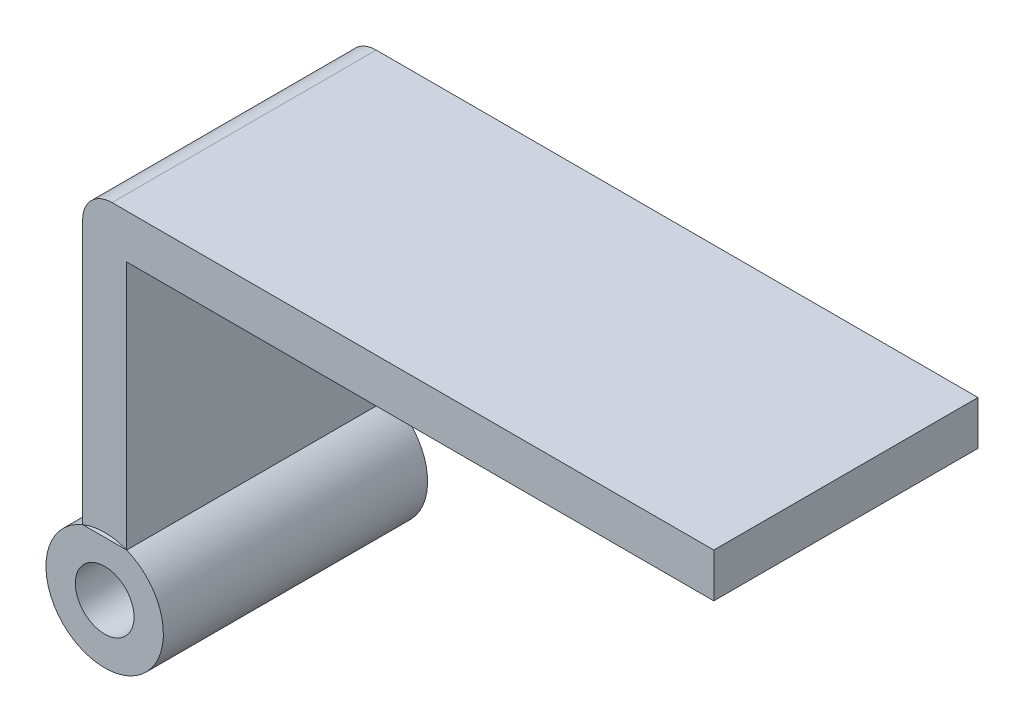
ISO-10303-21;
HEADER;
FILE_DESCRIPTION(('STEP AP214'),'2;1');
FILE_NAME('part.step','',(''),(''),'','','');
FILE_SCHEMA(('AUTOMOTIVE_DESIGN { 1 0 10303 214 1 1 1 1 }'));
ENDSEC;
DATA;
#1=APPLICATION_CONTEXT('core data for automotive mechanical design processes');
#2=APPLICATION_PROTOCOL_DEFINITION('international standard','automotive_design',2000,#1);
#3=PRODUCT_CONTEXT('',#1,'mechanical');
#4=PRODUCT('Part','Part','',(#3));
#5=PRODUCT_RELATED_PRODUCT_CATEGORY('part','',(#4));
#6=PRODUCT_DEFINITION_FORMATION('','',#4);
#7=PRODUCT_DEFINITION_CONTEXT('part definition',#1,'design');
#8=PRODUCT_DEFINITION('design','',#6,#7);
#9=PRODUCT_DEFINITION_SHAPE('','',#8);
#10=(LENGTH_UNIT() NAMED_UNIT(*) SI_UNIT(.MILLI.,.METRE.));
#11=(NAMED_UNIT(*) PLANE_ANGLE_UNIT() SI_UNIT($,.RADIAN.));
#12=(NAMED_UNIT(*) SI_UNIT($,.STERADIAN.) SOLID_ANGLE_UNIT());
#13=UNCERTAINTY_MEASURE_WITH_UNIT(LENGTH_MEASURE(1.E-05),#10,'distance_accuracy_value','');
#14=(GEOMETRIC_REPRESENTATION_CONTEXT(3) GLOBAL_UNCERTAINTY_ASSIGNED_CONTEXT((#13)) GLOBAL_UNIT_ASSIGNED_CONTEXT((#10,
#11,#12)) REPRESENTATION_CONTEXT('',''));
#15=CARTESIAN_POINT('',(0.,0.,0.));
#16=DIRECTION('',(0.,0.,1.));
#17=DIRECTION('',(1.,0.,0.));
#18=AXIS2_PLACEMENT_3D('',#15,#16,#17);
#19=CARTESIAN_POINT('',(0.,30.3964397372014,18.));
#20=DIRECTION('',(0.,1.,0.));
#21=DIRECTION('',(0.,0.,1.));
#22=AXIS2_PLACEMENT_3D('',#19,#20,#21);
#23=PLANE('',#22);
#24=DIRECTION('',(1.,0.,0.));
#25=VECTOR('',#24,1.);
#26=CARTESIAN_POINT('',(0.,30.3964397372014,0.));
#27=LINE('',#26,#25);
#28=CARTESIAN_POINT('',(-1.5,30.3964397372014,0.));
#29=VERTEX_POINT('',#28);
#30=CARTESIAN_POINT('',(1.5,30.3964397372014,0.));
#31=VERTEX_POINT('',#30);
#32=EDGE_CURVE('E100',#29,#31,#27,.T.);
#33=ORIENTED_EDGE('',*,*,#32,.F.);
#34=DIRECTION('',(0.,0.,-1.));
#35=VECTOR('',#34,1.);
#36=CARTESIAN_POINT('',(-1.5,30.3964397372014,18.));
#37=LINE('',#36,#35);
#38=CARTESIAN_POINT('',(-1.5,30.3964397372014,18.));
#39=VERTEX_POINT('',#38);
#40=EDGE_CURVE('E13',#39,#29,#37,.T.);
#41=ORIENTED_EDGE('',*,*,#40,.F.);
#42=DIRECTION('',(1.,0.,0.));
#43=VECTOR('',#42,1.);
#44=CARTESIAN_POINT('',(0.,30.3964397372014,18.));
#45=LINE('',#44,#43);
#46=CARTESIAN_POINT('',(1.5,30.3964397372014,18.));
#47=VERTEX_POINT('',#46);
#48=EDGE_CURVE('E101',#39,#47,#45,.T.);
#49=ORIENTED_EDGE('',*,*,#48,.T.);
#50=DIRECTION('',(0.,0.,-1.));
#51=VECTOR('',#50,1.);
#52=CARTESIAN_POINT('',(1.5,30.3964397372014,18.));
#53=LINE('',#52,#51);
#54=EDGE_CURVE('E80',#47,#31,#53,.T.);
#55=ORIENTED_EDGE('',*,*,#54,.T.);
#56=EDGE_LOOP('',(#33,#41,#49,#55));
#57=FACE_BOUND('',#56,.T.);
#58=ADVANCED_FACE('F71',(#57),#23,.T.);
#59=CARTESIAN_POINT('',(0.,26.6883404936536,18.));
#60=DIRECTION('',(0.,0.,-1.));
#61=DIRECTION('',(-1.,0.,0.));
#62=AXIS2_PLACEMENT_3D('',#59,#60,#61);
#63=CYLINDRICAL_SURFACE('',#62,2.);
#64=CARTESIAN_POINT('',(0.,26.6883404936536,18.));
#65=DIRECTION('',(0.,0.,1.));
#66=DIRECTION('',(1.,0.,0.));
#67=AXIS2_PLACEMENT_3D('',#64,#65,#66);
#68=CIRCLE('',#67,2.);
#69=CARTESIAN_POINT('',(2.,26.6883404936536,18.));
#70=VERTEX_POINT('',#69);
#71=EDGE_CURVE('E105',#70,#70,#68,.T.);
#72=ORIENTED_EDGE('',*,*,#71,.T.);
#73=EDGE_LOOP('',(#72));
#74=FACE_BOUND('',#73,.T.);
#75=CARTESIAN_POINT('',(0.,26.6883404936536,0.));
#76=DIRECTION('',(0.,0.,1.));
#77=DIRECTION('',(1.,0.,0.));
#78=AXIS2_PLACEMENT_3D('',#75,#76,#77);
#79=CIRCLE('',#78,2.);
#80=CARTESIAN_POINT('',(2.,26.6883404936536,0.));
#81=VERTEX_POINT('',#80);
#82=EDGE_CURVE('E108',#81,#81,#79,.T.);
#83=ORIENTED_EDGE('',*,*,#82,.F.);
#84=EDGE_LOOP('',(#83));
#85=FACE_BOUND('',#84,.T.);
#86=ADVANCED_FACE('F73',(#74,#85),#63,.F.);
#87=CARTESIAN_POINT('',(0.,26.6883404936536,18.));
#88=DIRECTION('',(0.,0.,-1.));
#89=DIRECTION('',(-1.,0.,0.));
#90=AXIS2_PLACEMENT_3D('',#87,#88,#89);
#91=CYLINDRICAL_SURFACE('',#90,4.);
#92=CARTESIAN_POINT('',(0.,26.6883404936536,0.));
#93=DIRECTION('',(0.,0.,1.));
#94=DIRECTION('',(1.,0.,0.));
#95=AXIS2_PLACEMENT_3D('',#92,#93,#94);
#96=CIRCLE('',#95,4.);
#97=EDGE_CURVE('E102',#29,#31,#96,.T.);
#98=ORIENTED_EDGE('',*,*,#97,.T.);
#99=ORIENTED_EDGE('',*,*,#54,.F.);
#100=CARTESIAN_POINT('',(0.,26.6883404936536,18.));
#101=DIRECTION('',(0.,0.,1.));
#102=DIRECTION('',(1.,0.,0.));
#103=AXIS2_PLACEMENT_3D('',#100,#101,#102);
#104=CIRCLE('',#103,4.);
#105=EDGE_CURVE('E87',#39,#47,#104,.T.);
#106=ORIENTED_EDGE('',*,*,#105,.F.);
#107=ORIENTED_EDGE('',*,*,#40,.T.);
#108=EDGE_LOOP('',(#98,#99,#106,#107));
#109=FACE_BOUND('',#108,.T.);
#110=ADVANCED_FACE('F103',(#109),#91,.T.);
#111=CARTESIAN_POINT('',(0.,0.,18.));
#112=DIRECTION('',(0.,0.,1.));
#113=DIRECTION('',(1.,0.,0.));
#114=AXIS2_PLACEMENT_3D('',#111,#112,#113);
#115=PLANE('',#114);
#116=ORIENTED_EDGE('',*,*,#71,.F.);
#117=EDGE_LOOP('',(#116));
#118=FACE_BOUND('',#117,.T.);
#119=ORIENTED_EDGE('',*,*,#48,.F.);
#120=ORIENTED_EDGE('',*,*,#105,.T.);
#121=EDGE_LOOP('',(#119,#120));
#122=FACE_BOUND('',#121,.T.);
#123=ADVANCED_FACE('F120',(#118,#122),#115,.T.);
#124=CARTESIAN_POINT('',(0.,0.,0.));
#125=DIRECTION('',(0.,0.,1.));
#126=DIRECTION('',(1.,0.,0.));
#127=AXIS2_PLACEMENT_3D('',#124,#125,#126);
#128=PLANE('',#127);
#129=ORIENTED_EDGE('',*,*,#82,.T.);
#130=EDGE_LOOP('',(#129));
#131=FACE_BOUND('',#130,.T.);
#132=ORIENTED_EDGE('',*,*,#32,.T.);
#133=ORIENTED_EDGE('',*,*,#97,.F.);
#134=EDGE_LOOP('',(#132,#133));
#135=FACE_BOUND('',#134,.T.);
#136=ADVANCED_FACE('F107',(#131,#135),#128,.F.);
#137=CLOSED_SHELL('',(#58,#86,#110,#123,#136));
#138=MANIFOLD_SOLID_BREP('B2',#137);
#139=CARTESIAN_POINT('',(0.,26.6883404936536,18.));
#140=DIRECTION('',(0.,0.,-1.));
#141=DIRECTION('',(-1.,0.,0.));
#142=AXIS2_PLACEMENT_3D('',#139,#140,#141);
#143=CYLINDRICAL_SURFACE('',#142,4.);
#144=CARTESIAN_POINT('',(0.,26.6883404936536,0.));
#145=DIRECTION('',(0.,0.,1.));
#146=DIRECTION('',(1.,0.,0.));
#147=AXIS2_PLACEMENT_3D('',#144,#145,#146);
#148=CIRCLE('',#147,4.);
#149=CARTESIAN_POINT('',(1.5,30.3964397372014,0.));
#150=VERTEX_POINT('',#149);
#151=CARTESIAN_POINT('',(-1.5,30.3964397372014,0.));
#152=VERTEX_POINT('',#151);
#153=EDGE_CURVE('E227',#150,#152,#148,.T.);
#154=ORIENTED_EDGE('',*,*,#153,.F.);
#155=DIRECTION('',(0.,0.,-1.));
#156=VECTOR('',#155,1.);
#157=CARTESIAN_POINT('',(1.5,30.3964397372014,18.));
#158=LINE('',#157,#156);
#159=CARTESIAN_POINT('',(1.5,30.3964397372014,18.));
#160=VERTEX_POINT('',#159);
#161=EDGE_CURVE('E221',#160,#150,#158,.T.);
#162=ORIENTED_EDGE('',*,*,#161,.F.);
#163=CARTESIAN_POINT('',(0.,26.6883404936536,18.));
#164=DIRECTION('',(0.,0.,1.));
#165=DIRECTION('',(1.,0.,0.));
#166=AXIS2_PLACEMENT_3D('',#163,#164,#165);
#167=CIRCLE('',#166,4.);
#168=CARTESIAN_POINT('',(-1.5,30.3964397372014,18.));
#169=VERTEX_POINT('',#168);
#170=EDGE_CURVE('E224',#160,#169,#167,.T.);
#171=ORIENTED_EDGE('',*,*,#170,.T.);
#172=DIRECTION('',(0.,0.,-1.));
#173=VECTOR('',#172,1.);
#174=CARTESIAN_POINT('',(-1.5,30.3964397372014,18.));
#175=LINE('',#174,#173);
#176=EDGE_CURVE('E256',#169,#152,#175,.T.);
#177=ORIENTED_EDGE('',*,*,#176,.T.);
#178=EDGE_LOOP('',(#154,#162,#171,#177));
#179=FACE_BOUND('',#178,.T.);
#180=ADVANCED_FACE('F164',(#179),#143,.F.);
#181=CARTESIAN_POINT('',(1.5,0.,18.));
#182=DIRECTION('',(-1.,0.,0.));
#183=DIRECTION('',(0.,0.,1.));
#184=AXIS2_PLACEMENT_3D('',#181,#182,#183);
#185=PLANE('',#184);
#186=DIRECTION('',(0.,1.,0.));
#187=VECTOR('',#186,1.);
#188=CARTESIAN_POINT('',(1.5,0.,0.));
#189=LINE('',#188,#187);
#190=CARTESIAN_POINT('',(1.5,47.3964397372014,0.));
#191=VERTEX_POINT('',#190);
#192=EDGE_CURVE('E258',#150,#191,#189,.T.);
#193=ORIENTED_EDGE('',*,*,#192,.T.);
#194=DIRECTION('',(0.,0.,-1.));
#195=VECTOR('',#194,1.);
#196=CARTESIAN_POINT('',(1.5,47.3964397372014,18.));
#197=LINE('',#196,#195);
#198=CARTESIAN_POINT('',(1.5,47.3964397372014,18.));
#199=VERTEX_POINT('',#198);
#200=EDGE_CURVE('E231',#199,#191,#197,.T.);
#201=ORIENTED_EDGE('',*,*,#200,.F.);
#202=DIRECTION('',(0.,1.,0.));
#203=VECTOR('',#202,1.);
#204=CARTESIAN_POINT('',(1.5,0.,18.));
#205=LINE('',#204,#203);
#206=EDGE_CURVE('E234',#160,#199,#205,.T.);
#207=ORIENTED_EDGE('',*,*,#206,.F.);
#208=ORIENTED_EDGE('',*,*,#161,.T.);
#209=EDGE_LOOP('',(#193,#201,#207,#208));
#210=FACE_BOUND('',#209,.T.);
#211=ADVANCED_FACE('F235',(#210),#185,.F.);
#212=CARTESIAN_POINT('',(0.,47.3964397372014,18.));
#213=DIRECTION('',(0.,1.,0.));
#214=DIRECTION('',(0.,0.,1.));
#215=AXIS2_PLACEMENT_3D('',#212,#213,#214);
#216=PLANE('',#215);
#217=DIRECTION('',(1.,0.,0.));
#218=VECTOR('',#217,1.);
#219=CARTESIAN_POINT('',(0.,47.3964397372014,0.));
#220=LINE('',#219,#218);
#221=CARTESIAN_POINT('',(41.5,47.3964397372014,0.));
#222=VERTEX_POINT('',#221);
#223=EDGE_CURVE('E260',#191,#222,#220,.T.);
#224=ORIENTED_EDGE('',*,*,#223,.T.);
#225=DIRECTION('',(0.,0.,-1.));
#226=VECTOR('',#225,1.);
#227=CARTESIAN_POINT('',(41.5,47.3964397372014,18.));
#228=LINE('',#227,#226);
#229=CARTESIAN_POINT('',(41.5,47.3964397372014,18.));
#230=VERTEX_POINT('',#229);
#231=EDGE_CURVE('E271',#230,#222,#228,.T.);
#232=ORIENTED_EDGE('',*,*,#231,.F.);
#233=DIRECTION('',(1.,0.,0.));
#234=VECTOR('',#233,1.);
#235=CARTESIAN_POINT('',(0.,47.3964397372014,18.));
#236=LINE('',#235,#234);
#237=EDGE_CURVE('E239',#199,#230,#236,.T.);
#238=ORIENTED_EDGE('',*,*,#237,.F.);
#239=ORIENTED_EDGE('',*,*,#200,.T.);
#240=EDGE_LOOP('',(#224,#232,#238,#239));
#241=FACE_BOUND('',#240,.T.);
#242=ADVANCED_FACE('F285',(#241),#216,.F.);
#243=CARTESIAN_POINT('',(41.5,0.,18.));
#244=DIRECTION('',(1.,0.,0.));
#245=DIRECTION('',(0.,0.,-1.));
#246=AXIS2_PLACEMENT_3D('',#243,#244,#245);
#247=PLANE('',#246);
#248=DIRECTION('',(0.,-1.,0.));
#249=VECTOR('',#248,1.);
#250=CARTESIAN_POINT('',(41.5,0.,0.));
#251=LINE('',#250,#249);
#252=CARTESIAN_POINT('',(41.5,50.3964397372014,0.));
#253=VERTEX_POINT('',#252);
#254=EDGE_CURVE('E263',#253,#222,#251,.T.);
#255=ORIENTED_EDGE('',*,*,#254,.F.);
#256=DIRECTION('',(0.,0.,-1.));
#257=VECTOR('',#256,1.);
#258=CARTESIAN_POINT('',(41.5,50.3964397372014,18.));
#259=LINE('',#258,#257);
#260=CARTESIAN_POINT('',(41.5,50.3964397372014,18.));
#261=VERTEX_POINT('',#260);
#262=EDGE_CURVE('E268',#261,#253,#259,.T.);
#263=ORIENTED_EDGE('',*,*,#262,.F.);
#264=DIRECTION('',(0.,-1.,0.));
#265=VECTOR('',#264,1.);
#266=CARTESIAN_POINT('',(41.5,0.,18.));
#267=LINE('',#266,#265);
#268=EDGE_CURVE('E250',#261,#230,#267,.T.);
#269=ORIENTED_EDGE('',*,*,#268,.T.);
#270=ORIENTED_EDGE('',*,*,#231,.T.);
#271=EDGE_LOOP('',(#255,#263,#269,#270));
#272=FACE_BOUND('',#271,.T.);
#273=ADVANCED_FACE('F291',(#272),#247,.T.);
#274=CARTESIAN_POINT('',(0.,50.3964397372014,18.));
#275=DIRECTION('',(0.,1.,0.));
#276=DIRECTION('',(0.,0.,1.));
#277=AXIS2_PLACEMENT_3D('',#274,#275,#276);
#278=PLANE('',#277);
#279=DIRECTION('',(1.,0.,0.));
#280=VECTOR('',#279,1.);
#281=CARTESIAN_POINT('',(0.,50.3964397372014,0.));
#282=LINE('',#281,#280);
#283=CARTESIAN_POINT('',(0.5,50.3964397372014,0.));
#284=VERTEX_POINT('',#283);
#285=EDGE_CURVE('E246',#284,#253,#282,.T.);
#286=ORIENTED_EDGE('',*,*,#285,.F.);
#287=DIRECTION('',(0.,0.,-1.));
#288=VECTOR('',#287,1.);
#289=CARTESIAN_POINT('',(0.5,50.3964397372014,18.));
#290=LINE('',#289,#288);
#291=CARTESIAN_POINT('',(0.5,50.3964397372014,18.));
#292=VERTEX_POINT('',#291);
#293=EDGE_CURVE('E172',#284,#292,#290,.F.);
#294=ORIENTED_EDGE('',*,*,#293,.T.);
#295=DIRECTION('',(1.,0.,0.));
#296=VECTOR('',#295,1.);
#297=CARTESIAN_POINT('',(0.,50.3964397372014,18.));
#298=LINE('',#297,#296);
#299=EDGE_CURVE('E253',#292,#261,#298,.T.);
#300=ORIENTED_EDGE('',*,*,#299,.T.);
#301=ORIENTED_EDGE('',*,*,#262,.T.);
#302=EDGE_LOOP('',(#286,#294,#300,#301));
#303=FACE_BOUND('',#302,.T.);
#304=ADVANCED_FACE('F292',(#303),#278,.T.);
#305=CARTESIAN_POINT('',(-1.5,0.,18.));
#306=DIRECTION('',(-1.,0.,0.));
#307=DIRECTION('',(0.,-1.,0.));
#308=AXIS2_PLACEMENT_3D('',#305,#306,#307);
#309=PLANE('',#308);
#310=DIRECTION('',(0.,1.,0.));
#311=VECTOR('',#310,1.);
#312=CARTESIAN_POINT('',(-1.5,0.,18.));
#313=LINE('',#312,#311);
#314=CARTESIAN_POINT('',(-1.5,48.3964397372014,18.));
#315=VERTEX_POINT('',#314);
#316=EDGE_CURVE('E243',#169,#315,#313,.T.);
#317=ORIENTED_EDGE('',*,*,#316,.T.);
#318=DIRECTION('',(0.,0.,-1.));
#319=VECTOR('',#318,1.);
#320=CARTESIAN_POINT('',(-1.5,48.3964397372014,18.));
#321=LINE('',#320,#319);
#322=CARTESIAN_POINT('',(-1.5,48.3964397372014,0.));
#323=VERTEX_POINT('',#322);
#324=EDGE_CURVE('E230',#315,#323,#321,.T.);
#325=ORIENTED_EDGE('',*,*,#324,.T.);
#326=DIRECTION('',(0.,1.,0.));
#327=VECTOR('',#326,1.);
#328=CARTESIAN_POINT('',(-1.5,0.,0.));
#329=LINE('',#328,#327);
#330=EDGE_CURVE('E244',#152,#323,#329,.T.);
#331=ORIENTED_EDGE('',*,*,#330,.F.);
#332=ORIENTED_EDGE('',*,*,#176,.F.);
#333=EDGE_LOOP('',(#317,#325,#331,#332));
#334=FACE_BOUND('',#333,.T.);
#335=ADVANCED_FACE('F279',(#334),#309,.T.);
#336=CARTESIAN_POINT('',(0.,0.,18.));
#337=DIRECTION('',(0.,0.,1.));
#338=DIRECTION('',(1.,0.,0.));
#339=AXIS2_PLACEMENT_3D('',#336,#337,#338);
#340=PLANE('',#339);
#341=ORIENTED_EDGE('',*,*,#299,.F.);
#342=CARTESIAN_POINT('',(0.5,48.3964397372014,18.));
#343=DIRECTION('',(0.,0.,1.));
#344=DIRECTION('',(1.,0.,0.));
#345=AXIS2_PLACEMENT_3D('',#342,#343,#344);
#346=CIRCLE('',#345,2.);
#347=EDGE_CURVE('E69',#292,#315,#346,.T.);
#348=ORIENTED_EDGE('',*,*,#347,.T.);
#349=ORIENTED_EDGE('',*,*,#316,.F.);
#350=ORIENTED_EDGE('',*,*,#170,.F.);
#351=ORIENTED_EDGE('',*,*,#206,.T.);
#352=ORIENTED_EDGE('',*,*,#237,.T.);
#353=ORIENTED_EDGE('',*,*,#268,.F.);
#354=EDGE_LOOP('',(#341,#348,#349,#350,#351,#352,#353));
#355=FACE_BOUND('',#354,.T.);
#356=ADVANCED_FACE('F241',(#355),#340,.T.);
#357=CARTESIAN_POINT('',(0.,0.,0.));
#358=DIRECTION('',(0.,0.,1.));
#359=DIRECTION('',(1.,0.,0.));
#360=AXIS2_PLACEMENT_3D('',#357,#358,#359);
#361=PLANE('',#360);
#362=ORIENTED_EDGE('',*,*,#330,.T.);
#363=CARTESIAN_POINT('',(0.5,48.3964397372014,0.));
#364=DIRECTION('',(0.,0.,1.));
#365=DIRECTION('',(1.,0.,0.));
#366=AXIS2_PLACEMENT_3D('',#363,#364,#365);
#367=CIRCLE('',#366,2.);
#368=EDGE_CURVE('E186',#323,#284,#367,.F.);
#369=ORIENTED_EDGE('',*,*,#368,.T.);
#370=ORIENTED_EDGE('',*,*,#285,.T.);
#371=ORIENTED_EDGE('',*,*,#254,.T.);
#372=ORIENTED_EDGE('',*,*,#223,.F.);
#373=ORIENTED_EDGE('',*,*,#192,.F.);
#374=ORIENTED_EDGE('',*,*,#153,.T.);
#375=EDGE_LOOP('',(#362,#369,#370,#371,#372,#373,#374));
#376=FACE_BOUND('',#375,.T.);
#377=ADVANCED_FACE('F282',(#376),#361,.F.);
#378=CARTESIAN_POINT('',(0.5,48.3964397372014,18.));
#379=DIRECTION('',(0.,0.,-1.));
#380=DIRECTION('',(-1.,0.,0.));
#381=AXIS2_PLACEMENT_3D('',#378,#379,#380);
#382=CYLINDRICAL_SURFACE('',#381,2.);
#383=ORIENTED_EDGE('',*,*,#347,.F.);
#384=ORIENTED_EDGE('',*,*,#293,.F.);
#385=ORIENTED_EDGE('',*,*,#368,.F.);
#386=ORIENTED_EDGE('',*,*,#324,.F.);
#387=EDGE_LOOP('',(#383,#384,#385,#386));
#388=FACE_BOUND('',#387,.T.);
#389=ADVANCED_FACE('F166',(#388),#382,.T.);
#390=CLOSED_SHELL('',(#180,#211,#242,#273,#304,#335,#356,#377,#389));
#391=MANIFOLD_SOLID_BREP('B7',#390);
#392=ADVANCED_BREP_SHAPE_REPRESENTATION('',(#18,#138,#391),#14);
#393=SHAPE_DEFINITION_REPRESENTATION(#9,#392);
ENDSEC;
END-ISO-10303-21;
